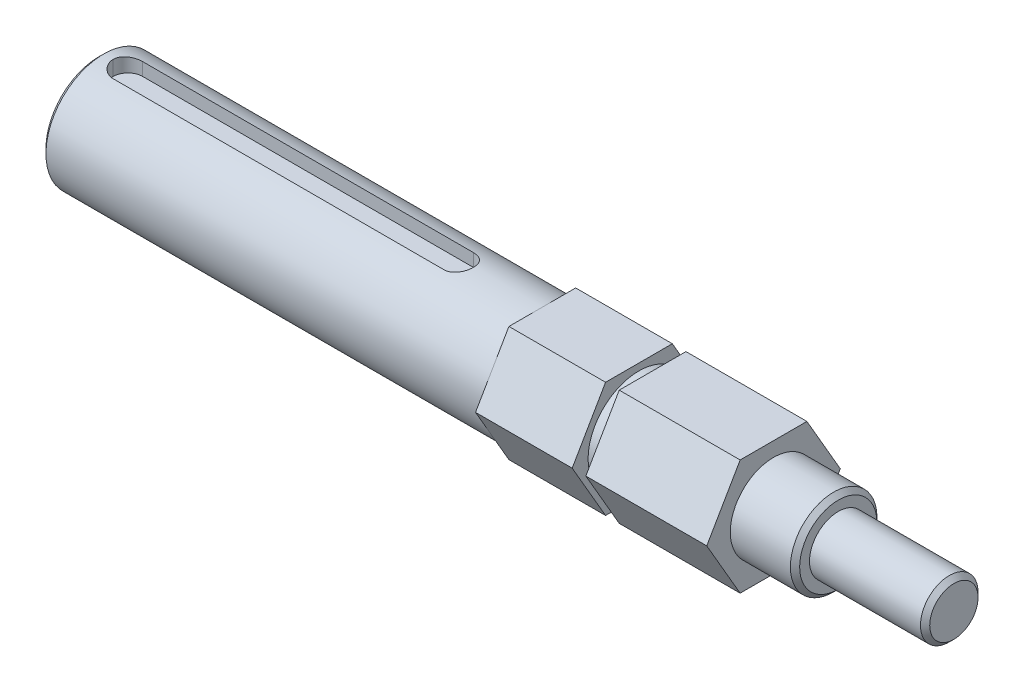
ISO-10303-21;
HEADER;
FILE_DESCRIPTION(('STEP AP214'),'2;1');
FILE_NAME('part.step','',(''),(''),'','','');
FILE_SCHEMA(('AUTOMOTIVE_DESIGN { 1 0 10303 214 1 1 1 1 }'));
ENDSEC;
DATA;
#1=APPLICATION_CONTEXT('core data for automotive mechanical design processes');
#2=APPLICATION_PROTOCOL_DEFINITION('international standard','automotive_design',2000,#1);
#3=PRODUCT_CONTEXT('',#1,'mechanical');
#4=PRODUCT('Part','Part','',(#3));
#5=PRODUCT_RELATED_PRODUCT_CATEGORY('part','',(#4));
#6=PRODUCT_DEFINITION_FORMATION('','',#4);
#7=PRODUCT_DEFINITION_CONTEXT('part definition',#1,'design');
#8=PRODUCT_DEFINITION('design','',#6,#7);
#9=PRODUCT_DEFINITION_SHAPE('','',#8);
#10=(LENGTH_UNIT() NAMED_UNIT(*) SI_UNIT(.MILLI.,.METRE.));
#11=(NAMED_UNIT(*) PLANE_ANGLE_UNIT() SI_UNIT($,.RADIAN.));
#12=(NAMED_UNIT(*) SI_UNIT($,.STERADIAN.) SOLID_ANGLE_UNIT());
#13=UNCERTAINTY_MEASURE_WITH_UNIT(LENGTH_MEASURE(1.E-05),#10,'distance_accuracy_value','');
#14=(GEOMETRIC_REPRESENTATION_CONTEXT(3) GLOBAL_UNCERTAINTY_ASSIGNED_CONTEXT((#13)) GLOBAL_UNIT_ASSIGNED_CONTEXT((#10,
#11,#12)) REPRESENTATION_CONTEXT('',''));
#15=CARTESIAN_POINT('',(0.,0.,0.));
#16=DIRECTION('',(0.,0.,1.));
#17=DIRECTION('',(1.,0.,0.));
#18=AXIS2_PLACEMENT_3D('',#15,#16,#17);
#19=CARTESIAN_POINT('',(-77.8966516553296,0.,0.));
#20=DIRECTION('',(-1.,0.,0.));
#21=DIRECTION('',(0.,0.,1.));
#22=AXIS2_PLACEMENT_3D('',#19,#20,#21);
#23=CYLINDRICAL_SURFACE('',#22,4.7498);
#24=CARTESIAN_POINT('',(19.888107544,0.,0.));
#25=DIRECTION('',(-1.,0.,0.));
#26=DIRECTION('',(0.,0.,1.));
#27=AXIS2_PLACEMENT_3D('',#24,#25,#26);
#28=CIRCLE('',#27,4.7498);
#29=CARTESIAN_POINT('',(19.888107544,0.,4.7498));
#30=VERTEX_POINT('',#29);
#31=EDGE_CURVE('E350',#30,#30,#28,.T.);
#32=ORIENTED_EDGE('',*,*,#31,.T.);
#33=EDGE_LOOP('',(#32));
#34=FACE_BOUND('',#33,.T.);
#35=CARTESIAN_POINT('',(13.2842,0.,0.));
#36=DIRECTION('',(-1.,0.,0.));
#37=DIRECTION('',(0.,0.,1.));
#38=AXIS2_PLACEMENT_3D('',#35,#36,#37);
#39=CIRCLE('',#38,4.7498);
#40=CARTESIAN_POINT('',(13.2842,0.,4.7498));
#41=VERTEX_POINT('',#40);
#42=EDGE_CURVE('E341',#41,#41,#39,.T.);
#43=ORIENTED_EDGE('',*,*,#42,.F.);
#44=EDGE_LOOP('',(#43));
#45=FACE_BOUND('',#44,.T.);
#46=ADVANCED_FACE('F38',(#34,#45),#23,.T.);
#47=CARTESIAN_POINT('',(20.3962,4.7498,0.));
#48=DIRECTION('',(-1.,0.,0.));
#49=DIRECTION('',(0.,0.,1.));
#50=AXIS2_PLACEMENT_3D('',#47,#48,#49);
#51=PLANE('',#50);
#52=CARTESIAN_POINT('',(20.3962,0.,0.));
#53=DIRECTION('',(-1.,0.,0.));
#54=DIRECTION('',(0.,0.,1.));
#55=AXIS2_PLACEMENT_3D('',#52,#53,#54);
#56=CIRCLE('',#55,4.241707544);
#57=CARTESIAN_POINT('',(20.3962,0.,4.241707544));
#58=VERTEX_POINT('',#57);
#59=EDGE_CURVE('E353',#58,#58,#56,.F.);
#60=ORIENTED_EDGE('',*,*,#59,.T.);
#61=EDGE_LOOP('',(#60));
#62=FACE_BOUND('',#61,.T.);
#63=CARTESIAN_POINT('',(20.3962,0.,0.));
#64=DIRECTION('',(-1.,0.,0.));
#65=DIRECTION('',(0.,0.,1.));
#66=AXIS2_PLACEMENT_3D('',#63,#64,#65);
#67=CIRCLE('',#66,3.16215);
#68=CARTESIAN_POINT('',(20.3962,0.,3.16215));
#69=VERTEX_POINT('',#68);
#70=EDGE_CURVE('E331',#69,#69,#67,.T.);
#71=ORIENTED_EDGE('',*,*,#70,.T.);
#72=EDGE_LOOP('',(#71));
#73=FACE_BOUND('',#72,.T.);
#74=ADVANCED_FACE('F370',(#62,#73),#51,.F.);
#75=CARTESIAN_POINT('',(-77.8966516553296,0.,0.));
#76=DIRECTION('',(-1.,0.,0.));
#77=DIRECTION('',(0.,0.,1.));
#78=AXIS2_PLACEMENT_3D('',#75,#76,#77);
#79=CYLINDRICAL_SURFACE('',#78,3.16215);
#80=CARTESIAN_POINT('',(32.588107544,0.,0.));
#81=DIRECTION('',(-1.,0.,0.));
#82=DIRECTION('',(0.,0.,1.));
#83=AXIS2_PLACEMENT_3D('',#80,#81,#82);
#84=CIRCLE('',#83,3.16215);
#85=CARTESIAN_POINT('',(32.588107544,0.,3.16215));
#86=VERTEX_POINT('',#85);
#87=EDGE_CURVE('E344',#86,#86,#84,.T.);
#88=ORIENTED_EDGE('',*,*,#87,.T.);
#89=EDGE_LOOP('',(#88));
#90=FACE_BOUND('',#89,.T.);
#91=ORIENTED_EDGE('',*,*,#70,.F.);
#92=EDGE_LOOP('',(#91));
#93=FACE_BOUND('',#92,.T.);
#94=ADVANCED_FACE('F376',(#90,#93),#79,.T.);
#95=CARTESIAN_POINT('',(33.0962,3.16215,0.));
#96=DIRECTION('',(-1.,0.,0.));
#97=DIRECTION('',(0.,0.,1.));
#98=AXIS2_PLACEMENT_3D('',#95,#96,#97);
#99=PLANE('',#98);
#100=CARTESIAN_POINT('',(33.0962,0.,0.));
#101=DIRECTION('',(-1.,0.,0.));
#102=DIRECTION('',(0.,0.,1.));
#103=AXIS2_PLACEMENT_3D('',#100,#101,#102);
#104=CIRCLE('',#103,2.65405754399998);
#105=CARTESIAN_POINT('',(33.0962,0.,2.65405754399998));
#106=VERTEX_POINT('',#105);
#107=EDGE_CURVE('E347',#106,#106,#104,.F.);
#108=ORIENTED_EDGE('',*,*,#107,.T.);
#109=EDGE_LOOP('',(#108));
#110=FACE_BOUND('',#109,.T.);
#111=ADVANCED_FACE('F392',(#110),#99,.F.);
#112=CARTESIAN_POINT('',(13.2842,-6.3373,-3.66615));
#113=DIRECTION('',(1.,0.,0.));
#114=DIRECTION('',(0.,0.,-1.));
#115=AXIS2_PLACEMENT_3D('',#112,#113,#114);
#116=PLANE('',#115);
#117=DIRECTION('',(0.,0.,-1.));
#118=VECTOR('',#117,1.);
#119=CARTESIAN_POINT('',(13.2842,-6.3373,3.66615));
#120=LINE('',#119,#118);
#121=CARTESIAN_POINT('',(13.2842,-6.3373,3.66615));
#122=VERTEX_POINT('',#121);
#123=CARTESIAN_POINT('',(13.2842,-6.3373,-3.66615));
#124=VERTEX_POINT('',#123);
#125=EDGE_CURVE('E183',#122,#124,#120,.T.);
#126=ORIENTED_EDGE('',*,*,#125,.T.);
#127=DIRECTION('',(0.,0.865509960359254,-0.500891713366194));
#128=VECTOR('',#127,1.);
#129=CARTESIAN_POINT('',(13.2842,-6.3373,-3.66615));
#130=LINE('',#129,#128);
#131=CARTESIAN_POINT('',(13.2842,0.,-7.3337));
#132=VERTEX_POINT('',#131);
#133=EDGE_CURVE('E172',#124,#132,#130,.T.);
#134=ORIENTED_EDGE('',*,*,#133,.T.);
#135=DIRECTION('',(0.,0.865509960359254,0.500891713366194));
#136=VECTOR('',#135,1.);
#137=CARTESIAN_POINT('',(13.2842,0.,-7.3337));
#138=LINE('',#137,#136);
#139=CARTESIAN_POINT('',(13.2842,6.3373,-3.66615));
#140=VERTEX_POINT('',#139);
#141=EDGE_CURVE('E182',#132,#140,#138,.T.);
#142=ORIENTED_EDGE('',*,*,#141,.T.);
#143=DIRECTION('',(0.,0.,1.));
#144=VECTOR('',#143,1.);
#145=CARTESIAN_POINT('',(13.2842,6.3373,-3.66615));
#146=LINE('',#145,#144);
#147=CARTESIAN_POINT('',(13.2842,6.3373,3.66615));
#148=VERTEX_POINT('',#147);
#149=EDGE_CURVE('E751',#140,#148,#146,.T.);
#150=ORIENTED_EDGE('',*,*,#149,.T.);
#151=DIRECTION('',(0.,-0.865509960359254,0.500891713366194));
#152=VECTOR('',#151,1.);
#153=CARTESIAN_POINT('',(13.2842,6.3373,3.66615));
#154=LINE('',#153,#152);
#155=CARTESIAN_POINT('',(13.2842,0.,7.3337));
#156=VERTEX_POINT('',#155);
#157=EDGE_CURVE('E753',#148,#156,#154,.T.);
#158=ORIENTED_EDGE('',*,*,#157,.T.);
#159=DIRECTION('',(0.,-0.865509960359254,-0.500891713366194));
#160=VECTOR('',#159,1.);
#161=CARTESIAN_POINT('',(13.2842,0.,7.3337));
#162=LINE('',#161,#160);
#163=EDGE_CURVE('E189',#156,#122,#162,.T.);
#164=ORIENTED_EDGE('',*,*,#163,.T.);
#165=EDGE_LOOP('',(#126,#134,#142,#150,#158,#164));
#166=FACE_BOUND('',#165,.T.);
#167=ORIENTED_EDGE('',*,*,#42,.T.);
#168=EDGE_LOOP('',(#167));
#169=FACE_BOUND('',#168,.T.);
#170=ADVANCED_FACE('F186',(#166,#169),#116,.T.);
#171=CARTESIAN_POINT('',(-77.8966516553296,0.,0.));
#172=DIRECTION('',(-1.,0.,0.));
#173=DIRECTION('',(0.,0.,1.));
#174=AXIS2_PLACEMENT_3D('',#171,#172,#173);
#175=CYLINDRICAL_SURFACE('',#174,6.3373);
#176=CARTESIAN_POINT('',(-60.299507544,0.,0.));
#177=DIRECTION('',(1.,0.,0.));
#178=DIRECTION('',(0.,0.,-1.));
#179=AXIS2_PLACEMENT_3D('',#176,#177,#178);
#180=CIRCLE('',#179,6.3373);
#181=CARTESIAN_POINT('',(-60.299507544,0.,-6.3373));
#182=VERTEX_POINT('',#181);
#183=EDGE_CURVE('E11',#182,#182,#180,.T.);
#184=ORIENTED_EDGE('',*,*,#183,.T.);
#185=EDGE_LOOP('',(#184));
#186=FACE_BOUND('',#185,.T.);
#187=CARTESIAN_POINT('',(-12.1158,0.,0.));
#188=DIRECTION('',(-1.,0.,0.));
#189=DIRECTION('',(0.,0.,1.));
#190=AXIS2_PLACEMENT_3D('',#187,#188,#189);
#191=CIRCLE('',#190,6.3373);
#192=CARTESIAN_POINT('',(-12.1158,6.3373,0.));
#193=VERTEX_POINT('',#192);
#194=CARTESIAN_POINT('',(-12.1158,-6.3373,0.));
#195=VERTEX_POINT('',#194);
#196=EDGE_CURVE('E260',#193,#195,#191,.T.);
#197=ORIENTED_EDGE('',*,*,#196,.T.);
#198=EDGE_CURVE('E259',#195,#193,#191,.T.);
#199=ORIENTED_EDGE('',*,*,#198,.T.);
#200=EDGE_LOOP('',(#197,#199));
#201=FACE_BOUND('',#200,.T.);
#202=DIRECTION('',(-1.,0.,0.));
#203=VECTOR('',#202,1.);
#204=CARTESIAN_POINT('',(-19.685,6.12525884595908,-1.6256));
#205=LINE('',#204,#203);
#206=CARTESIAN_POINT('',(-21.3106,6.12525884595908,-1.6256));
#207=VERTEX_POINT('',#206);
#208=CARTESIAN_POINT('',(-57.6326,6.12525884595908,-1.6256));
#209=VERTEX_POINT('',#208);
#210=EDGE_CURVE('E335',#207,#209,#205,.T.);
#211=ORIENTED_EDGE('',*,*,#210,.F.);
#212=CARTESIAN_POINT('',(-21.3106,6.12525884595908,-1.6256));
#213=CARTESIAN_POINT('',(-21.2656704057156,6.12525572384563,-1.62560059359541));
#214=CARTESIAN_POINT('',(-21.2207631160373,6.12575382111828,-1.62373611327884));
#215=CARTESIAN_POINT('',(-21.1312852297546,6.12772023070614,-1.61630382884971));
#216=CARTESIAN_POINT('',(-21.0867145755947,6.1291883731897,-1.61073667298571));
#217=CARTESIAN_POINT('',(-20.9541866425597,6.13498823313774,-1.58856472188929));
#218=CARTESIAN_POINT('',(-20.867141318364,6.1407157654718,-1.56648906409845));
#219=CARTESIAN_POINT('',(-20.6981498950922,6.15522368993519,-1.50846753261054));
#220=CARTESIAN_POINT('',(-20.6162032514929,6.16400375540148,-1.4725231430134));
#221=CARTESIAN_POINT('',(-20.4594573465982,6.18362256546917,-1.38782812844854));
#222=CARTESIAN_POINT('',(-20.3846603993658,6.19446197322662,-1.33907337630429));
#223=CARTESIAN_POINT('',(-20.2426607202283,6.2172556448923,-1.22895152920036));
#224=CARTESIAN_POINT('',(-20.1756473789229,6.22922835050251,-1.16734411036551));
#225=CARTESIAN_POINT('',(-20.0527746810287,6.25278150355666,-1.03377269014187));
#226=CARTESIAN_POINT('',(-19.996917445204,6.26436187607171,-0.961806724069569));
#227=CARTESIAN_POINT('',(-19.897152763142,6.28603333152416,-0.808240287847817));
#228=CARTESIAN_POINT('',(-19.8534373219082,6.2960994438836,-0.72651138810322));
#229=CARTESIAN_POINT('',(-19.7804621122823,6.3133870022584,-0.556585175203296));
#230=CARTESIAN_POINT('',(-19.7511910142288,6.3206106768832,-0.468392994195326));
#231=CARTESIAN_POINT('',(-19.7148282586417,6.32969793982603,-0.316446996824047));
#232=CARTESIAN_POINT('',(-19.703660534494,6.33253187833251,-0.253696589976846));
#233=CARTESIAN_POINT('',(-19.688741482479,6.33634021383192,-0.127308675421664));
#234=CARTESIAN_POINT('',(-19.6849851812931,6.33731585778887,-0.0636717914664028));
#235=CARTESIAN_POINT('',(-19.685,6.3373,0.));
#236=B_SPLINE_CURVE_WITH_KNOTS('',3,(#212,#213,#214,#215,#216,#217,#218,#219,#220,#221,#222,
#223,#224,#225,#226,#227,#228,#229,#230,#231,#232,#233,#234,#235),.UNSPECIFIED.,.F.,.F.,(4,2,2,
2,2,2,2,2,2,2,2,4),(0.,0.134703499533245,0.269383421961178,0.537937715227137,0.806463278330569,
1.07507545991937,1.34925144595122,1.62347950304872,1.90182481040237,2.17995144456139,
2.37091142600285,2.56174322311852),.UNSPECIFIED.);
#237=CARTESIAN_POINT('',(-19.685,6.3373,0.));
#238=VERTEX_POINT('',#237);
#239=EDGE_CURVE('E60',#207,#238,#236,.T.);
#240=ORIENTED_EDGE('',*,*,#239,.T.);
#241=CARTESIAN_POINT('',(-19.685,6.3373,0.));
#242=CARTESIAN_POINT('',(-19.6849994724776,6.33730262510674,0.0449542425937188));
#243=CARTESIAN_POINT('',(-19.6868659368972,6.3368210850164,0.0898862632128934));
#244=CARTESIAN_POINT('',(-19.6943065539844,6.33491762685194,0.179415017360768));
#245=CARTESIAN_POINT('',(-19.6998801100268,6.33349586009957,0.224011803674766));
#246=CARTESIAN_POINT('',(-19.722079783265,6.32787281500522,0.356627420790512));
#247=CARTESIAN_POINT('',(-19.744185266898,6.32231346764921,0.443736130091751));
#248=CARTESIAN_POINT('',(-19.8022935544823,6.30816926443299,0.612857979566186));
#249=CARTESIAN_POINT('',(-19.8382957426156,6.29958454264057,0.694871345347297));
#250=CARTESIAN_POINT('',(-19.923125953312,6.28030081893936,0.851727985893962));
#251=CARTESIAN_POINT('',(-19.9719575827631,6.2696012226615,0.926569236192276));
#252=CARTESIAN_POINT('',(-20.0821587854166,6.24699181616045,1.06852125543959));
#253=CARTESIAN_POINT('',(-20.1437513207542,6.23506269652202,1.13545577598838));
#254=CARTESIAN_POINT('',(-20.2772601848964,6.21146345120383,1.25817578073134));
#255=CARTESIAN_POINT('',(-20.3491788334945,6.19979338440312,1.31395875294065));
#256=CARTESIAN_POINT('',(-20.5026996009408,6.17783487513916,1.41364180067815));
#257=CARTESIAN_POINT('',(-20.5844383675886,6.1675715555603,1.45733724079769));
#258=CARTESIAN_POINT('',(-20.7543836681778,6.14988260208591,1.53027187336696));
#259=CARTESIAN_POINT('',(-20.8425848081236,6.14245463303677,1.55952296782704));
#260=CARTESIAN_POINT('',(-20.9944765842876,6.13310075202288,1.59583291165458));
#261=CARTESIAN_POINT('',(-21.0571592670381,6.13017934666502,1.6069770692438));
#262=CARTESIAN_POINT('',(-21.1834164651046,6.12624993016256,1.62186584965615));
#263=CARTESIAN_POINT('',(-21.2469904164994,6.12524075968339,1.62561495594876));
#264=CARTESIAN_POINT('',(-21.3106,6.12525884595908,1.6256));
#265=B_SPLINE_CURVE_WITH_KNOTS('',3,(#241,#242,#243,#244,#245,#246,#247,#248,#249,#250,#251,
#252,#253,#254,#255,#256,#257,#258,#259,#260,#261,#262,#263,#264),.UNSPECIFIED.,.F.,.F.,(4,2,2,
2,2,2,2,2,2,2,2,4),(0.,0.134777673646629,0.269533661211901,0.538262128855104,0.806978689442318,
1.07577087838815,1.34972979958482,1.62375036308561,1.90215983877244,2.18033952316408,
2.37109902366022,2.56174283495162),.UNSPECIFIED.);
#266=CARTESIAN_POINT('',(-21.3106,6.12525884595908,1.6256));
#267=VERTEX_POINT('',#266);
#268=EDGE_CURVE('E284',#238,#267,#265,.T.);
#269=ORIENTED_EDGE('',*,*,#268,.T.);
#270=DIRECTION('',(-1.,0.,0.));
#271=VECTOR('',#270,1.);
#272=CARTESIAN_POINT('',(-19.685,6.12525884595908,1.6256));
#273=LINE('',#272,#271);
#274=CARTESIAN_POINT('',(-57.6326,6.12525884595908,1.6256));
#275=VERTEX_POINT('',#274);
#276=EDGE_CURVE('E742',#267,#275,#273,.T.);
#277=ORIENTED_EDGE('',*,*,#276,.T.);
#278=CARTESIAN_POINT('',(-57.6326,6.12525884595908,1.6256));
#279=CARTESIAN_POINT('',(-57.6775295942844,6.12525572384562,1.62560059359541));
#280=CARTESIAN_POINT('',(-57.7224368839627,6.12575382111828,1.62373611327884));
#281=CARTESIAN_POINT('',(-57.8119147702454,6.12772023070614,1.61630382884971));
#282=CARTESIAN_POINT('',(-57.8564854244053,6.1291883731897,1.61073667298571));
#283=CARTESIAN_POINT('',(-57.9890133574403,6.13498823313774,1.58856472188929));
#284=CARTESIAN_POINT('',(-58.076058681636,6.1407157654718,1.56648906409845));
#285=CARTESIAN_POINT('',(-58.2450501049078,6.15522368993518,1.50846753261054));
#286=CARTESIAN_POINT('',(-58.3269967485071,6.16400375540147,1.4725231430134));
#287=CARTESIAN_POINT('',(-58.4837426534018,6.18362256546917,1.38782812844854));
#288=CARTESIAN_POINT('',(-58.5585396006342,6.19446197322662,1.33907337630429));
#289=CARTESIAN_POINT('',(-58.7005392797717,6.2172556448923,1.22895152920036));
#290=CARTESIAN_POINT('',(-58.7675526210771,6.22922835050251,1.16734411036551));
#291=CARTESIAN_POINT('',(-58.8904253189713,6.25278150355666,1.03377269014188));
#292=CARTESIAN_POINT('',(-58.946282554796,6.2643618760717,0.961806724069576));
#293=CARTESIAN_POINT('',(-59.046047236858,6.28603333152416,0.808240287847822));
#294=CARTESIAN_POINT('',(-59.0897626780918,6.2960994438836,0.726511388103223));
#295=CARTESIAN_POINT('',(-59.1627378877177,6.3133870022584,0.5565851752033));
#296=CARTESIAN_POINT('',(-59.1920089857712,6.3206106768832,0.468392994195332));
#297=CARTESIAN_POINT('',(-59.2283717413583,6.32969793982603,0.316446996824053));
#298=CARTESIAN_POINT('',(-59.239539465506,6.33253187833251,0.25369658997685));
#299=CARTESIAN_POINT('',(-59.254458517521,6.33634021383191,0.127308675421667));
#300=CARTESIAN_POINT('',(-59.2582148187069,6.33731585778887,0.063671791466404));
#301=CARTESIAN_POINT('',(-59.2582,6.3373,0.));
#302=B_SPLINE_CURVE_WITH_KNOTS('',3,(#278,#279,#280,#281,#282,#283,#284,#285,#286,#287,#288,
#289,#290,#291,#292,#293,#294,#295,#296,#297,#298,#299,#300,#301),.UNSPECIFIED.,.F.,.F.,(4,2,2,
2,2,2,2,2,2,2,2,4),(0.,0.134703499533245,0.269383421961175,0.537937715227133,0.806463278330568,
1.07507545991937,1.34925144595121,1.62347950304871,1.90182481040237,2.17995144456138,
2.37091142600284,2.56174322311852),.UNSPECIFIED.);
#303=CARTESIAN_POINT('',(-59.2582,6.3373,0.));
#304=VERTEX_POINT('',#303);
#305=EDGE_CURVE('E53',#275,#304,#302,.T.);
#306=ORIENTED_EDGE('',*,*,#305,.T.);
#307=CARTESIAN_POINT('',(-59.2582,6.3373,0.));
#308=CARTESIAN_POINT('',(-59.2582005275224,6.33730262510674,-0.0449542425937189));
#309=CARTESIAN_POINT('',(-59.2563340631028,6.3368210850164,-0.0898862632128936));
#310=CARTESIAN_POINT('',(-59.2488934460156,6.33491762685194,-0.179415017360768));
#311=CARTESIAN_POINT('',(-59.2433198899732,6.33349586009958,-0.224011803674766));
#312=CARTESIAN_POINT('',(-59.221120216735,6.32787281500522,-0.356627420790512));
#313=CARTESIAN_POINT('',(-59.199014733102,6.32231346764921,-0.443736130091751));
#314=CARTESIAN_POINT('',(-59.1409064455177,6.30816926443299,-0.612857979566185));
#315=CARTESIAN_POINT('',(-59.1049042573844,6.29958454264057,-0.694871345347295));
#316=CARTESIAN_POINT('',(-59.020074046688,6.28030081893936,-0.85172798589396));
#317=CARTESIAN_POINT('',(-58.9712424172369,6.2696012226615,-0.926569236192274));
#318=CARTESIAN_POINT('',(-58.8610412145834,6.24699181616045,-1.06852125543958));
#319=CARTESIAN_POINT('',(-58.7994486792458,6.23506269652202,-1.13545577598838));
#320=CARTESIAN_POINT('',(-58.6659398151036,6.21146345120383,-1.25817578073134));
#321=CARTESIAN_POINT('',(-58.5940211665055,6.19979338440312,-1.31395875294064));
#322=CARTESIAN_POINT('',(-58.4405003990592,6.17783487513916,-1.41364180067815));
#323=CARTESIAN_POINT('',(-58.3587616324114,6.1675715555603,-1.45733724079769));
#324=CARTESIAN_POINT('',(-58.1888163318222,6.14988260208591,-1.53027187336696));
#325=CARTESIAN_POINT('',(-58.1006151918764,6.14245463303677,-1.55952296782704));
#326=CARTESIAN_POINT('',(-57.9487234157124,6.13310075202288,-1.59583291165458));
#327=CARTESIAN_POINT('',(-57.8860407329619,6.13017934666502,-1.6069770692438));
#328=CARTESIAN_POINT('',(-57.7597835348954,6.12624993016256,-1.62186584965615));
#329=CARTESIAN_POINT('',(-57.6962095835006,6.12524075968339,-1.62561495594876));
#330=CARTESIAN_POINT('',(-57.6326,6.12525884595908,-1.6256));
#331=B_SPLINE_CURVE_WITH_KNOTS('',3,(#307,#308,#309,#310,#311,#312,#313,#314,#315,#316,#317,
#318,#319,#320,#321,#322,#323,#324,#325,#326,#327,#328,#329,#330),.UNSPECIFIED.,.F.,.F.,(4,2,2,
2,2,2,2,2,2,2,2,4),(0.,0.134777673646629,0.2695336612119,0.538262128855103,0.806978689442315,
1.07577087838815,1.34972979958481,1.6237503630856,1.90215983877244,2.18033952316408,
2.37109902366021,2.56174283495161),.UNSPECIFIED.);
#332=EDGE_CURVE('E325',#304,#209,#331,.T.);
#333=ORIENTED_EDGE('',*,*,#332,.T.);
#334=EDGE_LOOP('',(#211,#240,#269,#277,#306,#333));
#335=FACE_BOUND('',#334,.T.);
#336=ADVANCED_FACE('F298',(#186,#201,#335),#175,.T.);
#337=CARTESIAN_POINT('',(-1.4986,12.6721808864228,0.));
#338=DIRECTION('',(-1.,0.,0.));
#339=DIRECTION('',(0.,0.,1.));
#340=AXIS2_PLACEMENT_3D('',#337,#338,#339);
#341=PLANE('',#340);
#342=DIRECTION('',(0.,-0.865509960359254,0.500891713366194));
#343=VECTOR('',#342,1.);
#344=CARTESIAN_POINT('',(-1.4986,0.,7.3337));
#345=LINE('',#344,#343);
#346=CARTESIAN_POINT('',(-1.4986,6.3373,3.66615));
#347=VERTEX_POINT('',#346);
#348=CARTESIAN_POINT('',(-1.4986,0.,7.3337));
#349=VERTEX_POINT('',#348);
#350=EDGE_CURVE('E207',#347,#349,#345,.T.);
#351=ORIENTED_EDGE('',*,*,#350,.T.);
#352=DIRECTION('',(0.,-0.865509960359254,-0.500891713366194));
#353=VECTOR('',#352,1.);
#354=CARTESIAN_POINT('',(-1.4986,-6.3373,3.66615));
#355=LINE('',#354,#353);
#356=CARTESIAN_POINT('',(-1.4986,-6.3373,3.66615));
#357=VERTEX_POINT('',#356);
#358=EDGE_CURVE('E210',#349,#357,#355,.T.);
#359=ORIENTED_EDGE('',*,*,#358,.T.);
#360=DIRECTION('',(0.,0.,-1.));
#361=VECTOR('',#360,1.);
#362=CARTESIAN_POINT('',(-1.4986,-6.3373,-3.66615));
#363=LINE('',#362,#361);
#364=CARTESIAN_POINT('',(-1.4986,-6.3373,-3.66615));
#365=VERTEX_POINT('',#364);
#366=EDGE_CURVE('E213',#357,#365,#363,.T.);
#367=ORIENTED_EDGE('',*,*,#366,.T.);
#368=DIRECTION('',(0.,0.865509960359254,-0.500891713366194));
#369=VECTOR('',#368,1.);
#370=CARTESIAN_POINT('',(-1.4986,0.,-7.3337));
#371=LINE('',#370,#369);
#372=CARTESIAN_POINT('',(-1.4986,0.,-7.3337));
#373=VERTEX_POINT('',#372);
#374=EDGE_CURVE('E215',#365,#373,#371,.T.);
#375=ORIENTED_EDGE('',*,*,#374,.T.);
#376=DIRECTION('',(0.,0.865509960359254,0.500891713366194));
#377=VECTOR('',#376,1.);
#378=CARTESIAN_POINT('',(-1.4986,6.3373,-3.66615));
#379=LINE('',#378,#377);
#380=CARTESIAN_POINT('',(-1.4986,6.3373,-3.66615));
#381=VERTEX_POINT('',#380);
#382=EDGE_CURVE('E217',#373,#381,#379,.T.);
#383=ORIENTED_EDGE('',*,*,#382,.T.);
#384=DIRECTION('',(0.,0.,1.));
#385=VECTOR('',#384,1.);
#386=CARTESIAN_POINT('',(-1.4986,6.3373,3.66615));
#387=LINE('',#386,#385);
#388=EDGE_CURVE('E219',#381,#347,#387,.T.);
#389=ORIENTED_EDGE('',*,*,#388,.T.);
#390=EDGE_LOOP('',(#351,#359,#367,#375,#383,#389));
#391=FACE_BOUND('',#390,.T.);
#392=CARTESIAN_POINT('',(-1.4986,0.,0.));
#393=DIRECTION('',(-1.,0.,0.));
#394=DIRECTION('',(0.,0.,1.));
#395=AXIS2_PLACEMENT_3D('',#392,#393,#394);
#396=CIRCLE('',#395,5.588);
#397=CARTESIAN_POINT('',(-1.4986,0.,5.588));
#398=VERTEX_POINT('',#397);
#399=EDGE_CURVE('E263',#398,#398,#396,.F.);
#400=ORIENTED_EDGE('',*,*,#399,.F.);
#401=EDGE_LOOP('',(#400));
#402=FACE_BOUND('',#401,.T.);
#403=ADVANCED_FACE('F406',(#391,#402),#341,.F.);
#404=CARTESIAN_POINT('',(-44.9326,0.,0.));
#405=DIRECTION('',(-1.,0.,0.));
#406=DIRECTION('',(0.,0.,1.));
#407=AXIS2_PLACEMENT_3D('',#404,#405,#406);
#408=CONICAL_SURFACE('',#407,3.175,1.01956320358639);
#409=CARTESIAN_POINT('',(-42.9806,0.,0.));
#410=VERTEX_POINT('',#409);
#411=VERTEX_LOOP('',#410);
#412=FACE_BOUND('',#411,.T.);
#413=CARTESIAN_POINT('',(-44.9326,0.,0.));
#414=DIRECTION('',(-1.,0.,0.));
#415=DIRECTION('',(0.,0.,1.));
#416=AXIS2_PLACEMENT_3D('',#413,#414,#415);
#417=CIRCLE('',#416,3.175);
#418=CARTESIAN_POINT('',(-44.9326,0.,3.175));
#419=VERTEX_POINT('',#418);
#420=EDGE_CURVE('E256',#419,#419,#417,.T.);
#421=ORIENTED_EDGE('',*,*,#420,.T.);
#422=EDGE_LOOP('',(#421));
#423=FACE_BOUND('',#422,.T.);
#424=ADVANCED_FACE('F443',(#412,#423),#408,.F.);
#425=CARTESIAN_POINT('',(-77.8966516553296,0.,0.));
#426=DIRECTION('',(-1.,0.,0.));
#427=DIRECTION('',(0.,0.,1.));
#428=AXIS2_PLACEMENT_3D('',#425,#426,#427);
#429=CYLINDRICAL_SURFACE('',#428,3.175);
#430=ORIENTED_EDGE('',*,*,#420,.F.);
#431=EDGE_LOOP('',(#430));
#432=FACE_BOUND('',#431,.T.);
#433=CARTESIAN_POINT('',(-60.8076,0.,0.));
#434=DIRECTION('',(-1.,0.,0.));
#435=DIRECTION('',(0.,0.,1.));
#436=AXIS2_PLACEMENT_3D('',#433,#434,#435);
#437=CIRCLE('',#436,3.175);
#438=CARTESIAN_POINT('',(-60.8076,0.,3.175));
#439=VERTEX_POINT('',#438);
#440=EDGE_CURVE('E253',#439,#439,#437,.T.);
#441=ORIENTED_EDGE('',*,*,#440,.T.);
#442=EDGE_LOOP('',(#441));
#443=FACE_BOUND('',#442,.T.);
#444=ADVANCED_FACE('F475',(#432,#443),#429,.F.);
#445=CARTESIAN_POINT('',(-60.8076,3.175,0.));
#446=DIRECTION('',(1.,0.,0.));
#447=DIRECTION('',(0.,0.,-1.));
#448=AXIS2_PLACEMENT_3D('',#445,#446,#447);
#449=PLANE('',#448);
#450=CARTESIAN_POINT('',(-60.8076,0.,0.));
#451=DIRECTION('',(1.,0.,0.));
#452=DIRECTION('',(0.,0.,-1.));
#453=AXIS2_PLACEMENT_3D('',#450,#451,#452);
#454=CIRCLE('',#453,5.82920754399999);
#455=CARTESIAN_POINT('',(-60.8076,0.,-5.82920754399999));
#456=VERTEX_POINT('',#455);
#457=EDGE_CURVE('E46',#456,#456,#454,.F.);
#458=ORIENTED_EDGE('',*,*,#457,.T.);
#459=EDGE_LOOP('',(#458));
#460=FACE_BOUND('',#459,.T.);
#461=ORIENTED_EDGE('',*,*,#440,.F.);
#462=EDGE_LOOP('',(#461));
#463=FACE_BOUND('',#462,.T.);
#464=ADVANCED_FACE('F358',(#460,#463),#449,.F.);
#465=CARTESIAN_POINT('',(-12.1158,12.6721808864228,0.));
#466=DIRECTION('',(-1.,0.,0.));
#467=DIRECTION('',(0.,0.,1.));
#468=AXIS2_PLACEMENT_3D('',#465,#466,#467);
#469=PLANE('',#468);
#470=ORIENTED_EDGE('',*,*,#196,.F.);
#471=DIRECTION('',(0.,0.,1.));
#472=VECTOR('',#471,1.);
#473=CARTESIAN_POINT('',(-12.1158,6.3373,3.66615));
#474=LINE('',#473,#472);
#475=CARTESIAN_POINT('',(-12.1158,6.3373,-3.66615));
#476=VERTEX_POINT('',#475);
#477=EDGE_CURVE('E211',#476,#193,#474,.T.);
#478=ORIENTED_EDGE('',*,*,#477,.F.);
#479=DIRECTION('',(0.,0.865509960359254,0.500891713366194));
#480=VECTOR('',#479,1.);
#481=CARTESIAN_POINT('',(-12.1158,6.3373,-3.66615));
#482=LINE('',#481,#480);
#483=CARTESIAN_POINT('',(-12.1158,0.,-7.3337));
#484=VERTEX_POINT('',#483);
#485=EDGE_CURVE('E232',#484,#476,#482,.T.);
#486=ORIENTED_EDGE('',*,*,#485,.F.);
#487=DIRECTION('',(0.,0.865509960359254,-0.500891713366194));
#488=VECTOR('',#487,1.);
#489=CARTESIAN_POINT('',(-12.1158,0.,-7.3337));
#490=LINE('',#489,#488);
#491=CARTESIAN_POINT('',(-12.1158,-6.3373,-3.66615));
#492=VERTEX_POINT('',#491);
#493=EDGE_CURVE('E230',#492,#484,#490,.T.);
#494=ORIENTED_EDGE('',*,*,#493,.F.);
#495=DIRECTION('',(0.,0.,-1.));
#496=VECTOR('',#495,1.);
#497=CARTESIAN_POINT('',(-12.1158,-6.3373,-3.66615));
#498=LINE('',#497,#496);
#499=EDGE_CURVE('E226',#195,#492,#498,.T.);
#500=ORIENTED_EDGE('',*,*,#499,.F.);
#501=EDGE_LOOP('',(#470,#478,#486,#494,#500));
#502=FACE_BOUND('',#501,.T.);
#503=ADVANCED_FACE('F445',(#502),#469,.T.);
#504=ORIENTED_EDGE('',*,*,#198,.F.);
#505=CARTESIAN_POINT('',(-12.1158,-6.3373,3.66615));
#506=VERTEX_POINT('',#505);
#507=EDGE_CURVE('E227',#506,#195,#498,.T.);
#508=ORIENTED_EDGE('',*,*,#507,.F.);
#509=DIRECTION('',(0.,-0.865509960359254,-0.500891713366194));
#510=VECTOR('',#509,1.);
#511=CARTESIAN_POINT('',(-12.1158,-6.3373,3.66615));
#512=LINE('',#511,#510);
#513=CARTESIAN_POINT('',(-12.1158,0.,7.3337));
#514=VERTEX_POINT('',#513);
#515=EDGE_CURVE('E224',#514,#506,#512,.T.);
#516=ORIENTED_EDGE('',*,*,#515,.F.);
#517=DIRECTION('',(0.,-0.865509960359254,0.500891713366194));
#518=VECTOR('',#517,1.);
#519=CARTESIAN_POINT('',(-12.1158,0.,7.3337));
#520=LINE('',#519,#518);
#521=CARTESIAN_POINT('',(-12.1158,6.3373,3.66615));
#522=VERTEX_POINT('',#521);
#523=EDGE_CURVE('E201',#522,#514,#520,.T.);
#524=ORIENTED_EDGE('',*,*,#523,.F.);
#525=EDGE_CURVE('E234',#193,#522,#474,.T.);
#526=ORIENTED_EDGE('',*,*,#525,.F.);
#527=EDGE_LOOP('',(#504,#508,#516,#524,#526));
#528=FACE_BOUND('',#527,.T.);
#529=ADVANCED_FACE('F448',(#528),#469,.T.);
#530=CARTESIAN_POINT('',(-1.4986,0.,7.3337));
#531=DIRECTION('',(0.,-0.500891713366194,-0.865509960359254));
#532=DIRECTION('',(0.,0.865509960359255,-0.500891713366195));
#533=AXIS2_PLACEMENT_3D('',#530,#531,#532);
#534=PLANE('',#533);
#535=ORIENTED_EDGE('',*,*,#523,.T.);
#536=DIRECTION('',(-1.,0.,0.));
#537=VECTOR('',#536,1.);
#538=CARTESIAN_POINT('',(-1.4986,0.,7.3337));
#539=LINE('',#538,#537);
#540=EDGE_CURVE('E250',#349,#514,#539,.T.);
#541=ORIENTED_EDGE('',*,*,#540,.F.);
#542=ORIENTED_EDGE('',*,*,#350,.F.);
#543=DIRECTION('',(-1.,0.,0.));
#544=VECTOR('',#543,1.);
#545=CARTESIAN_POINT('',(-1.4986,6.3373,3.66615));
#546=LINE('',#545,#544);
#547=EDGE_CURVE('E221',#347,#522,#546,.T.);
#548=ORIENTED_EDGE('',*,*,#547,.T.);
#549=EDGE_LOOP('',(#535,#541,#542,#548));
#550=FACE_BOUND('',#549,.T.);
#551=ADVANCED_FACE('F468',(#550),#534,.F.);
#552=CARTESIAN_POINT('',(-1.4986,-6.3373,3.66615));
#553=DIRECTION('',(0.,0.500891713366194,-0.865509960359254));
#554=DIRECTION('',(0.,0.865509960359255,0.500891713366195));
#555=AXIS2_PLACEMENT_3D('',#552,#553,#554);
#556=PLANE('',#555);
#557=ORIENTED_EDGE('',*,*,#515,.T.);
#558=DIRECTION('',(-1.,0.,0.));
#559=VECTOR('',#558,1.);
#560=CARTESIAN_POINT('',(-1.4986,-6.3373,3.66615));
#561=LINE('',#560,#559);
#562=EDGE_CURVE('E247',#357,#506,#561,.T.);
#563=ORIENTED_EDGE('',*,*,#562,.F.);
#564=ORIENTED_EDGE('',*,*,#358,.F.);
#565=ORIENTED_EDGE('',*,*,#540,.T.);
#566=EDGE_LOOP('',(#557,#563,#564,#565));
#567=FACE_BOUND('',#566,.T.);
#568=ADVANCED_FACE('F464',(#567),#556,.F.);
#569=CARTESIAN_POINT('',(-1.4986,-6.3373,-3.66615));
#570=DIRECTION('',(0.,1.,0.));
#571=DIRECTION('',(0.,0.,1.));
#572=AXIS2_PLACEMENT_3D('',#569,#570,#571);
#573=PLANE('',#572);
#574=ORIENTED_EDGE('',*,*,#507,.T.);
#575=ORIENTED_EDGE('',*,*,#499,.T.);
#576=DIRECTION('',(-1.,0.,0.));
#577=VECTOR('',#576,1.);
#578=CARTESIAN_POINT('',(-1.4986,-6.3373,-3.66615));
#579=LINE('',#578,#577);
#580=EDGE_CURVE('E244',#365,#492,#579,.T.);
#581=ORIENTED_EDGE('',*,*,#580,.F.);
#582=ORIENTED_EDGE('',*,*,#366,.F.);
#583=ORIENTED_EDGE('',*,*,#562,.T.);
#584=EDGE_LOOP('',(#574,#575,#581,#582,#583));
#585=FACE_BOUND('',#584,.T.);
#586=ADVANCED_FACE('F460',(#585),#573,.F.);
#587=CARTESIAN_POINT('',(-1.4986,0.,-7.3337));
#588=DIRECTION('',(0.,0.500891713366194,0.865509960359254));
#589=DIRECTION('',(0.,-0.865509960359255,0.500891713366195));
#590=AXIS2_PLACEMENT_3D('',#587,#588,#589);
#591=PLANE('',#590);
#592=ORIENTED_EDGE('',*,*,#493,.T.);
#593=DIRECTION('',(-1.,0.,0.));
#594=VECTOR('',#593,1.);
#595=CARTESIAN_POINT('',(-1.4986,0.,-7.3337));
#596=LINE('',#595,#594);
#597=EDGE_CURVE('E241',#373,#484,#596,.T.);
#598=ORIENTED_EDGE('',*,*,#597,.F.);
#599=ORIENTED_EDGE('',*,*,#374,.F.);
#600=ORIENTED_EDGE('',*,*,#580,.T.);
#601=EDGE_LOOP('',(#592,#598,#599,#600));
#602=FACE_BOUND('',#601,.T.);
#603=ADVANCED_FACE('F456',(#602),#591,.F.);
#604=CARTESIAN_POINT('',(-1.4986,6.3373,-3.66615));
#605=DIRECTION('',(0.,-0.500891713366194,0.865509960359254));
#606=DIRECTION('',(0.,-0.865509960359255,-0.500891713366195));
#607=AXIS2_PLACEMENT_3D('',#604,#605,#606);
#608=PLANE('',#607);
#609=ORIENTED_EDGE('',*,*,#485,.T.);
#610=DIRECTION('',(-1.,0.,0.));
#611=VECTOR('',#610,1.);
#612=CARTESIAN_POINT('',(-1.4986,6.3373,-3.66615));
#613=LINE('',#612,#611);
#614=EDGE_CURVE('E238',#381,#476,#613,.T.);
#615=ORIENTED_EDGE('',*,*,#614,.F.);
#616=ORIENTED_EDGE('',*,*,#382,.F.);
#617=ORIENTED_EDGE('',*,*,#597,.T.);
#618=EDGE_LOOP('',(#609,#615,#616,#617));
#619=FACE_BOUND('',#618,.T.);
#620=ADVANCED_FACE('F452',(#619),#608,.F.);
#621=CARTESIAN_POINT('',(-1.4986,6.3373,3.66615));
#622=DIRECTION('',(0.,-1.,0.));
#623=DIRECTION('',(0.,0.,-1.));
#624=AXIS2_PLACEMENT_3D('',#621,#622,#623);
#625=PLANE('',#624);
#626=ORIENTED_EDGE('',*,*,#477,.T.);
#627=ORIENTED_EDGE('',*,*,#525,.T.);
#628=ORIENTED_EDGE('',*,*,#547,.F.);
#629=ORIENTED_EDGE('',*,*,#388,.F.);
#630=ORIENTED_EDGE('',*,*,#614,.T.);
#631=EDGE_LOOP('',(#626,#627,#628,#629,#630));
#632=FACE_BOUND('',#631,.T.);
#633=ADVANCED_FACE('F439',(#632),#625,.F.);
#634=CARTESIAN_POINT('',(-77.8966516553296,0.,0.));
#635=DIRECTION('',(-1.,0.,0.));
#636=DIRECTION('',(0.,0.,1.));
#637=AXIS2_PLACEMENT_3D('',#634,#635,#636);
#638=CYLINDRICAL_SURFACE('',#637,5.588);
#639=ORIENTED_EDGE('',*,*,#399,.T.);
#640=EDGE_LOOP('',(#639));
#641=FACE_BOUND('',#640,.T.);
#642=CARTESIAN_POINT('',(0.,0.,0.));
#643=DIRECTION('',(1.,0.,0.));
#644=DIRECTION('',(0.,0.,-1.));
#645=AXIS2_PLACEMENT_3D('',#642,#643,#644);
#646=CIRCLE('',#645,5.588);
#647=CARTESIAN_POINT('',(0.,0.,-5.588));
#648=VERTEX_POINT('',#647);
#649=EDGE_CURVE('E198',#648,#648,#646,.T.);
#650=ORIENTED_EDGE('',*,*,#649,.F.);
#651=EDGE_LOOP('',(#650));
#652=FACE_BOUND('',#651,.T.);
#653=ADVANCED_FACE('F414',(#641,#652),#638,.T.);
#654=CARTESIAN_POINT('',(0.,-6.3373,-3.66615));
#655=DIRECTION('',(1.,0.,0.));
#656=DIRECTION('',(0.,0.,-1.));
#657=AXIS2_PLACEMENT_3D('',#654,#655,#656);
#658=PLANE('',#657);
#659=DIRECTION('',(0.,0.,-1.));
#660=VECTOR('',#659,1.);
#661=CARTESIAN_POINT('',(0.,-6.3373,3.66615));
#662=LINE('',#661,#660);
#663=CARTESIAN_POINT('',(0.,-6.3373,3.66615));
#664=VERTEX_POINT('',#663);
#665=CARTESIAN_POINT('',(0.,-6.3373,-3.66615));
#666=VERTEX_POINT('',#665);
#667=EDGE_CURVE('E197',#664,#666,#662,.T.);
#668=ORIENTED_EDGE('',*,*,#667,.F.);
#669=DIRECTION('',(0.,-0.865509960359254,-0.500891713366194));
#670=VECTOR('',#669,1.);
#671=CARTESIAN_POINT('',(0.,0.,7.3337));
#672=LINE('',#671,#670);
#673=CARTESIAN_POINT('',(0.,0.,7.3337));
#674=VERTEX_POINT('',#673);
#675=EDGE_CURVE('E193',#674,#664,#672,.T.);
#676=ORIENTED_EDGE('',*,*,#675,.F.);
#677=DIRECTION('',(0.,-0.865509960359254,0.500891713366194));
#678=VECTOR('',#677,1.);
#679=CARTESIAN_POINT('',(0.,6.3373,3.66615));
#680=LINE('',#679,#678);
#681=CARTESIAN_POINT('',(0.,6.3373,3.66615));
#682=VERTEX_POINT('',#681);
#683=EDGE_CURVE('E764',#682,#674,#680,.T.);
#684=ORIENTED_EDGE('',*,*,#683,.F.);
#685=DIRECTION('',(0.,0.,1.));
#686=VECTOR('',#685,1.);
#687=CARTESIAN_POINT('',(0.,6.3373,-3.66615));
#688=LINE('',#687,#686);
#689=CARTESIAN_POINT('',(0.,6.3373,-3.66615));
#690=VERTEX_POINT('',#689);
#691=EDGE_CURVE('E762',#690,#682,#688,.T.);
#692=ORIENTED_EDGE('',*,*,#691,.F.);
#693=DIRECTION('',(0.,0.865509960359254,0.500891713366194));
#694=VECTOR('',#693,1.);
#695=CARTESIAN_POINT('',(0.,0.,-7.3337));
#696=LINE('',#695,#694);
#697=CARTESIAN_POINT('',(0.,0.,-7.3337));
#698=VERTEX_POINT('',#697);
#699=EDGE_CURVE('E760',#698,#690,#696,.T.);
#700=ORIENTED_EDGE('',*,*,#699,.F.);
#701=DIRECTION('',(0.,0.865509960359254,-0.500891713366194));
#702=VECTOR('',#701,1.);
#703=CARTESIAN_POINT('',(0.,-6.3373,-3.66615));
#704=LINE('',#703,#702);
#705=EDGE_CURVE('E758',#666,#698,#704,.T.);
#706=ORIENTED_EDGE('',*,*,#705,.F.);
#707=EDGE_LOOP('',(#668,#676,#684,#692,#700,#706));
#708=FACE_BOUND('',#707,.T.);
#709=ORIENTED_EDGE('',*,*,#649,.T.);
#710=EDGE_LOOP('',(#709));
#711=FACE_BOUND('',#710,.T.);
#712=ADVANCED_FACE('F411',(#708,#711),#658,.F.);
#713=CARTESIAN_POINT('',(13.2842,-6.3373,3.66615));
#714=DIRECTION('',(0.,1.,0.));
#715=DIRECTION('',(0.,0.,1.));
#716=AXIS2_PLACEMENT_3D('',#713,#714,#715);
#717=PLANE('',#716);
#718=ORIENTED_EDGE('',*,*,#667,.T.);
#719=DIRECTION('',(-1.,0.,0.));
#720=VECTOR('',#719,1.);
#721=CARTESIAN_POINT('',(13.2842,-6.3373,-3.66615));
#722=LINE('',#721,#720);
#723=EDGE_CURVE('E176',#124,#666,#722,.T.);
#724=ORIENTED_EDGE('',*,*,#723,.F.);
#725=ORIENTED_EDGE('',*,*,#125,.F.);
#726=DIRECTION('',(-1.,0.,0.));
#727=VECTOR('',#726,1.);
#728=CARTESIAN_POINT('',(13.2842,-6.3373,3.66615));
#729=LINE('',#728,#727);
#730=EDGE_CURVE('E756',#122,#664,#729,.T.);
#731=ORIENTED_EDGE('',*,*,#730,.T.);
#732=EDGE_LOOP('',(#718,#724,#725,#731));
#733=FACE_BOUND('',#732,.T.);
#734=ADVANCED_FACE('F195',(#733),#717,.F.);
#735=CARTESIAN_POINT('',(13.2842,-6.3373,-3.66615));
#736=DIRECTION('',(0.,0.500891713366194,0.865509960359254));
#737=DIRECTION('',(0.,-0.865509960359254,0.500891713366194));
#738=AXIS2_PLACEMENT_3D('',#735,#736,#737);
#739=PLANE('',#738);
#740=ORIENTED_EDGE('',*,*,#705,.T.);
#741=DIRECTION('',(-1.,0.,0.));
#742=VECTOR('',#741,1.);
#743=CARTESIAN_POINT('',(13.2842,0.,-7.3337));
#744=LINE('',#743,#742);
#745=EDGE_CURVE('E179',#132,#698,#744,.T.);
#746=ORIENTED_EDGE('',*,*,#745,.F.);
#747=ORIENTED_EDGE('',*,*,#133,.F.);
#748=ORIENTED_EDGE('',*,*,#723,.T.);
#749=EDGE_LOOP('',(#740,#746,#747,#748));
#750=FACE_BOUND('',#749,.T.);
#751=ADVANCED_FACE('F174',(#750),#739,.F.);
#752=CARTESIAN_POINT('',(13.2842,0.,-7.3337));
#753=DIRECTION('',(0.,-0.500891713366194,0.865509960359254));
#754=DIRECTION('',(0.,-0.865509960359254,-0.500891713366194));
#755=AXIS2_PLACEMENT_3D('',#752,#753,#754);
#756=PLANE('',#755);
#757=ORIENTED_EDGE('',*,*,#699,.T.);
#758=DIRECTION('',(-1.,0.,0.));
#759=VECTOR('',#758,1.);
#760=CARTESIAN_POINT('',(13.2842,6.3373,-3.66615));
#761=LINE('',#760,#759);
#762=EDGE_CURVE('E203',#140,#690,#761,.T.);
#763=ORIENTED_EDGE('',*,*,#762,.F.);
#764=ORIENTED_EDGE('',*,*,#141,.F.);
#765=ORIENTED_EDGE('',*,*,#745,.T.);
#766=EDGE_LOOP('',(#757,#763,#764,#765));
#767=FACE_BOUND('',#766,.T.);
#768=ADVANCED_FACE('F428',(#767),#756,.F.);
#769=CARTESIAN_POINT('',(13.2842,6.3373,-3.66615));
#770=DIRECTION('',(0.,-1.,0.));
#771=DIRECTION('',(0.,0.,-1.));
#772=AXIS2_PLACEMENT_3D('',#769,#770,#771);
#773=PLANE('',#772);
#774=ORIENTED_EDGE('',*,*,#691,.T.);
#775=DIRECTION('',(-1.,0.,0.));
#776=VECTOR('',#775,1.);
#777=CARTESIAN_POINT('',(13.2842,6.3373,3.66615));
#778=LINE('',#777,#776);
#779=EDGE_CURVE('E771',#148,#682,#778,.T.);
#780=ORIENTED_EDGE('',*,*,#779,.F.);
#781=ORIENTED_EDGE('',*,*,#149,.F.);
#782=ORIENTED_EDGE('',*,*,#762,.T.);
#783=EDGE_LOOP('',(#774,#780,#781,#782));
#784=FACE_BOUND('',#783,.T.);
#785=ADVANCED_FACE('F424',(#784),#773,.F.);
#786=CARTESIAN_POINT('',(13.2842,6.3373,3.66615));
#787=DIRECTION('',(0.,-0.500891713366194,-0.865509960359254));
#788=DIRECTION('',(0.,0.865509960359254,-0.500891713366194));
#789=AXIS2_PLACEMENT_3D('',#786,#787,#788);
#790=PLANE('',#789);
#791=ORIENTED_EDGE('',*,*,#683,.T.);
#792=DIRECTION('',(-1.,0.,0.));
#793=VECTOR('',#792,1.);
#794=CARTESIAN_POINT('',(13.2842,0.,7.3337));
#795=LINE('',#794,#793);
#796=EDGE_CURVE('E768',#156,#674,#795,.T.);
#797=ORIENTED_EDGE('',*,*,#796,.F.);
#798=ORIENTED_EDGE('',*,*,#157,.F.);
#799=ORIENTED_EDGE('',*,*,#779,.T.);
#800=EDGE_LOOP('',(#791,#797,#798,#799));
#801=FACE_BOUND('',#800,.T.);
#802=ADVANCED_FACE('F420',(#801),#790,.F.);
#803=CARTESIAN_POINT('',(13.2842,0.,7.3337));
#804=DIRECTION('',(0.,0.500891713366194,-0.865509960359254));
#805=DIRECTION('',(0.,0.865509960359254,0.500891713366194));
#806=AXIS2_PLACEMENT_3D('',#803,#804,#805);
#807=PLANE('',#806);
#808=ORIENTED_EDGE('',*,*,#675,.T.);
#809=ORIENTED_EDGE('',*,*,#730,.F.);
#810=ORIENTED_EDGE('',*,*,#163,.F.);
#811=ORIENTED_EDGE('',*,*,#796,.T.);
#812=EDGE_LOOP('',(#808,#809,#810,#811));
#813=FACE_BOUND('',#812,.T.);
#814=ADVANCED_FACE('F416',(#813),#807,.F.);
#815=CARTESIAN_POINT('',(-19.685,4.7117,1.6256));
#816=DIRECTION('',(0.,0.,1.));
#817=DIRECTION('',(0.,-1.,0.));
#818=AXIS2_PLACEMENT_3D('',#815,#816,#817);
#819=PLANE('',#818);
#820=ORIENTED_EDGE('',*,*,#276,.F.);
#821=DIRECTION('',(0.,1.,0.));
#822=VECTOR('',#821,1.);
#823=CARTESIAN_POINT('',(-21.3106,4.7117,1.6256));
#824=LINE('',#823,#822);
#825=CARTESIAN_POINT('',(-21.3106,4.7117,1.6256));
#826=VERTEX_POINT('',#825);
#827=EDGE_CURVE('E269',#267,#826,#824,.F.);
#828=ORIENTED_EDGE('',*,*,#827,.T.);
#829=DIRECTION('',(-1.,0.,0.));
#830=VECTOR('',#829,1.);
#831=CARTESIAN_POINT('',(-19.685,4.7117,1.6256));
#832=LINE('',#831,#830);
#833=CARTESIAN_POINT('',(-57.6326,4.7117,1.6256));
#834=VERTEX_POINT('',#833);
#835=EDGE_CURVE('E738',#826,#834,#832,.T.);
#836=ORIENTED_EDGE('',*,*,#835,.T.);
#837=DIRECTION('',(0.,1.,0.));
#838=VECTOR('',#837,1.);
#839=CARTESIAN_POINT('',(-57.6326,6.12525884595908,1.6256));
#840=LINE('',#839,#838);
#841=EDGE_CURVE('E266',#834,#275,#840,.T.);
#842=ORIENTED_EDGE('',*,*,#841,.T.);
#843=EDGE_LOOP('',(#820,#828,#836,#842));
#844=FACE_BOUND('',#843,.T.);
#845=ADVANCED_FACE('F419',(#844),#819,.F.);
#846=CARTESIAN_POINT('',(-19.685,4.7117,-1.6256));
#847=DIRECTION('',(0.,-1.,0.));
#848=DIRECTION('',(0.,0.,-1.));
#849=AXIS2_PLACEMENT_3D('',#846,#847,#848);
#850=PLANE('',#849);
#851=ORIENTED_EDGE('',*,*,#835,.F.);
#852=CARTESIAN_POINT('',(-21.3106,4.7117,0.));
#853=DIRECTION('',(0.,-1.,0.));
#854=DIRECTION('',(0.,0.,-1.));
#855=AXIS2_PLACEMENT_3D('',#852,#853,#854);
#856=CIRCLE('',#855,1.6256);
#857=CARTESIAN_POINT('',(-19.685,4.7117,0.));
#858=VERTEX_POINT('',#857);
#859=EDGE_CURVE('E278',#826,#858,#856,.F.);
#860=ORIENTED_EDGE('',*,*,#859,.T.);
#861=CARTESIAN_POINT('',(-21.3106,4.7117,0.));
#862=DIRECTION('',(0.,-1.,0.));
#863=DIRECTION('',(0.,0.,-1.));
#864=AXIS2_PLACEMENT_3D('',#861,#862,#863);
#865=CIRCLE('',#864,1.6256);
#866=CARTESIAN_POINT('',(-21.3106,4.7117,-1.6256));
#867=VERTEX_POINT('',#866);
#868=EDGE_CURVE('E276',#858,#867,#865,.F.);
#869=ORIENTED_EDGE('',*,*,#868,.T.);
#870=DIRECTION('',(-1.,0.,0.));
#871=VECTOR('',#870,1.);
#872=CARTESIAN_POINT('',(-19.685,4.7117,-1.6256));
#873=LINE('',#872,#871);
#874=CARTESIAN_POINT('',(-57.6326,4.7117,-1.6256));
#875=VERTEX_POINT('',#874);
#876=EDGE_CURVE('E743',#867,#875,#873,.T.);
#877=ORIENTED_EDGE('',*,*,#876,.T.);
#878=CARTESIAN_POINT('',(-57.6326,4.7117,0.));
#879=DIRECTION('',(0.,-1.,0.));
#880=DIRECTION('',(0.,0.,-1.));
#881=AXIS2_PLACEMENT_3D('',#878,#879,#880);
#882=CIRCLE('',#881,1.6256);
#883=CARTESIAN_POINT('',(-59.2582,4.7117,0.));
#884=VERTEX_POINT('',#883);
#885=EDGE_CURVE('E272',#875,#884,#882,.F.);
#886=ORIENTED_EDGE('',*,*,#885,.T.);
#887=CARTESIAN_POINT('',(-57.6326,4.7117,0.));
#888=DIRECTION('',(0.,-1.,0.));
#889=DIRECTION('',(0.,0.,-1.));
#890=AXIS2_PLACEMENT_3D('',#887,#888,#889);
#891=CIRCLE('',#890,1.6256);
#892=EDGE_CURVE('E274',#884,#834,#891,.F.);
#893=ORIENTED_EDGE('',*,*,#892,.T.);
#894=EDGE_LOOP('',(#851,#860,#869,#877,#886,#893));
#895=FACE_BOUND('',#894,.T.);
#896=ADVANCED_FACE('F551',(#895),#850,.F.);
#897=CARTESIAN_POINT('',(-19.685,6.12525884595908,-1.6256));
#898=DIRECTION('',(0.,0.,-1.));
#899=DIRECTION('',(-1.,0.,0.));
#900=AXIS2_PLACEMENT_3D('',#897,#898,#899);
#901=PLANE('',#900);
#902=ORIENTED_EDGE('',*,*,#876,.F.);
#903=DIRECTION('',(0.,-1.,0.));
#904=VECTOR('',#903,1.);
#905=CARTESIAN_POINT('',(-21.3106,6.12525884595908,-1.6256));
#906=LINE('',#905,#904);
#907=EDGE_CURVE('E282',#867,#207,#906,.F.);
#908=ORIENTED_EDGE('',*,*,#907,.T.);
#909=ORIENTED_EDGE('',*,*,#210,.T.);
#910=DIRECTION('',(0.,-1.,0.));
#911=VECTOR('',#910,1.);
#912=CARTESIAN_POINT('',(-57.6326,4.7117,-1.6256));
#913=LINE('',#912,#911);
#914=EDGE_CURVE('E280',#209,#875,#913,.T.);
#915=ORIENTED_EDGE('',*,*,#914,.T.);
#916=EDGE_LOOP('',(#902,#908,#909,#915));
#917=FACE_BOUND('',#916,.T.);
#918=ADVANCED_FACE('F310',(#917),#901,.F.);
#919=CARTESIAN_POINT('',(-21.3106,0.,0.));
#920=DIRECTION('',(0.,-1.,0.));
#921=DIRECTION('',(0.,0.,-1.));
#922=AXIS2_PLACEMENT_3D('',#919,#920,#921);
#923=CYLINDRICAL_SURFACE('',#922,1.6256);
#924=ORIENTED_EDGE('',*,*,#907,.F.);
#925=ORIENTED_EDGE('',*,*,#868,.F.);
#926=DIRECTION('',(0.,-1.,0.));
#927=VECTOR('',#926,1.);
#928=CARTESIAN_POINT('',(-19.685,0.,0.));
#929=LINE('',#928,#927);
#930=EDGE_CURVE('E332',#238,#858,#929,.T.);
#931=ORIENTED_EDGE('',*,*,#930,.F.);
#932=ORIENTED_EDGE('',*,*,#239,.F.);
#933=EDGE_LOOP('',(#924,#925,#931,#932));
#934=FACE_BOUND('',#933,.T.);
#935=ADVANCED_FACE('F305',(#934),#923,.F.);
#936=CARTESIAN_POINT('',(-21.3106,0.,0.));
#937=DIRECTION('',(0.,1.,0.));
#938=DIRECTION('',(0.,0.,1.));
#939=AXIS2_PLACEMENT_3D('',#936,#937,#938);
#940=CYLINDRICAL_SURFACE('',#939,1.6256);
#941=ORIENTED_EDGE('',*,*,#859,.F.);
#942=ORIENTED_EDGE('',*,*,#827,.F.);
#943=ORIENTED_EDGE('',*,*,#268,.F.);
#944=ORIENTED_EDGE('',*,*,#930,.T.);
#945=EDGE_LOOP('',(#941,#942,#943,#944));
#946=FACE_BOUND('',#945,.T.);
#947=ADVANCED_FACE('F301',(#946),#940,.F.);
#948=CARTESIAN_POINT('',(-57.6326,6.12525884595908,0.));
#949=DIRECTION('',(0.,1.,0.));
#950=DIRECTION('',(0.,0.,1.));
#951=AXIS2_PLACEMENT_3D('',#948,#949,#950);
#952=CYLINDRICAL_SURFACE('',#951,1.6256);
#953=DIRECTION('',(0.,-1.,0.));
#954=VECTOR('',#953,1.);
#955=CARTESIAN_POINT('',(-59.2582,6.12525884595908,0.));
#956=LINE('',#955,#954);
#957=EDGE_CURVE('E336',#884,#304,#956,.F.);
#958=ORIENTED_EDGE('',*,*,#957,.F.);
#959=ORIENTED_EDGE('',*,*,#885,.F.);
#960=ORIENTED_EDGE('',*,*,#914,.F.);
#961=ORIENTED_EDGE('',*,*,#332,.F.);
#962=EDGE_LOOP('',(#958,#959,#960,#961));
#963=FACE_BOUND('',#962,.T.);
#964=ADVANCED_FACE('F304',(#963),#952,.F.);
#965=CARTESIAN_POINT('',(-57.6326,4.7117,0.));
#966=DIRECTION('',(0.,-1.,0.));
#967=DIRECTION('',(0.,0.,-1.));
#968=AXIS2_PLACEMENT_3D('',#965,#966,#967);
#969=CYLINDRICAL_SURFACE('',#968,1.6256);
#970=ORIENTED_EDGE('',*,*,#892,.F.);
#971=ORIENTED_EDGE('',*,*,#957,.T.);
#972=ORIENTED_EDGE('',*,*,#305,.F.);
#973=ORIENTED_EDGE('',*,*,#841,.F.);
#974=EDGE_LOOP('',(#970,#971,#972,#973));
#975=FACE_BOUND('',#974,.T.);
#976=ADVANCED_FACE('F312',(#975),#969,.F.);
#977=CARTESIAN_POINT('',(32.588107544,0.,0.));
#978=DIRECTION('',(-1.,0.,0.));
#979=DIRECTION('',(0.,0.,1.));
#980=AXIS2_PLACEMENT_3D('',#977,#978,#979);
#981=CONICAL_SURFACE('',#980,3.16215,0.785398163397459);
#982=ORIENTED_EDGE('',*,*,#107,.F.);
#983=EDGE_LOOP('',(#982));
#984=FACE_BOUND('',#983,.T.);
#985=ORIENTED_EDGE('',*,*,#87,.F.);
#986=EDGE_LOOP('',(#985));
#987=FACE_BOUND('',#986,.T.);
#988=ADVANCED_FACE('F316',(#984,#987),#981,.T.);
#989=CARTESIAN_POINT('',(19.888107544,0.,0.));
#990=DIRECTION('',(-1.,0.,0.));
#991=DIRECTION('',(0.,0.,1.));
#992=AXIS2_PLACEMENT_3D('',#989,#990,#991);
#993=CONICAL_SURFACE('',#992,4.7498,0.78539816339745);
#994=ORIENTED_EDGE('',*,*,#59,.F.);
#995=EDGE_LOOP('',(#994));
#996=FACE_BOUND('',#995,.T.);
#997=ORIENTED_EDGE('',*,*,#31,.F.);
#998=EDGE_LOOP('',(#997));
#999=FACE_BOUND('',#998,.T.);
#1000=ADVANCED_FACE('F362',(#996,#999),#993,.T.);
#1001=CARTESIAN_POINT('',(-60.8076,0.,0.));
#1002=DIRECTION('',(1.,0.,0.));
#1003=DIRECTION('',(0.,0.,-1.));
#1004=AXIS2_PLACEMENT_3D('',#1001,#1002,#1003);
#1005=CONICAL_SURFACE('',#1004,5.82920754399999,0.785398163397457);
#1006=ORIENTED_EDGE('',*,*,#183,.F.);
#1007=EDGE_LOOP('',(#1006));
#1008=FACE_BOUND('',#1007,.T.);
#1009=ORIENTED_EDGE('',*,*,#457,.F.);
#1010=EDGE_LOOP('',(#1009));
#1011=FACE_BOUND('',#1010,.T.);
#1012=ADVANCED_FACE('F40',(#1008,#1011),#1005,.T.);
#1013=CLOSED_SHELL('',(#46,#74,#94,#111,#170,#336,#403,#424,#444,#464,#503,#529,#551,#568,#586,
#603,#620,#633,#653,#712,#734,#751,#768,#785,#802,#814,#845,#896,#918,#935,#947,#964,#976,#988,
#1000,#1012));
#1014=MANIFOLD_SOLID_BREP('B2',#1013);
#1015=ADVANCED_BREP_SHAPE_REPRESENTATION('',(#18,#1014),#14);
#1016=SHAPE_DEFINITION_REPRESENTATION(#9,#1015);
ENDSEC;
END-ISO-10303-21;
